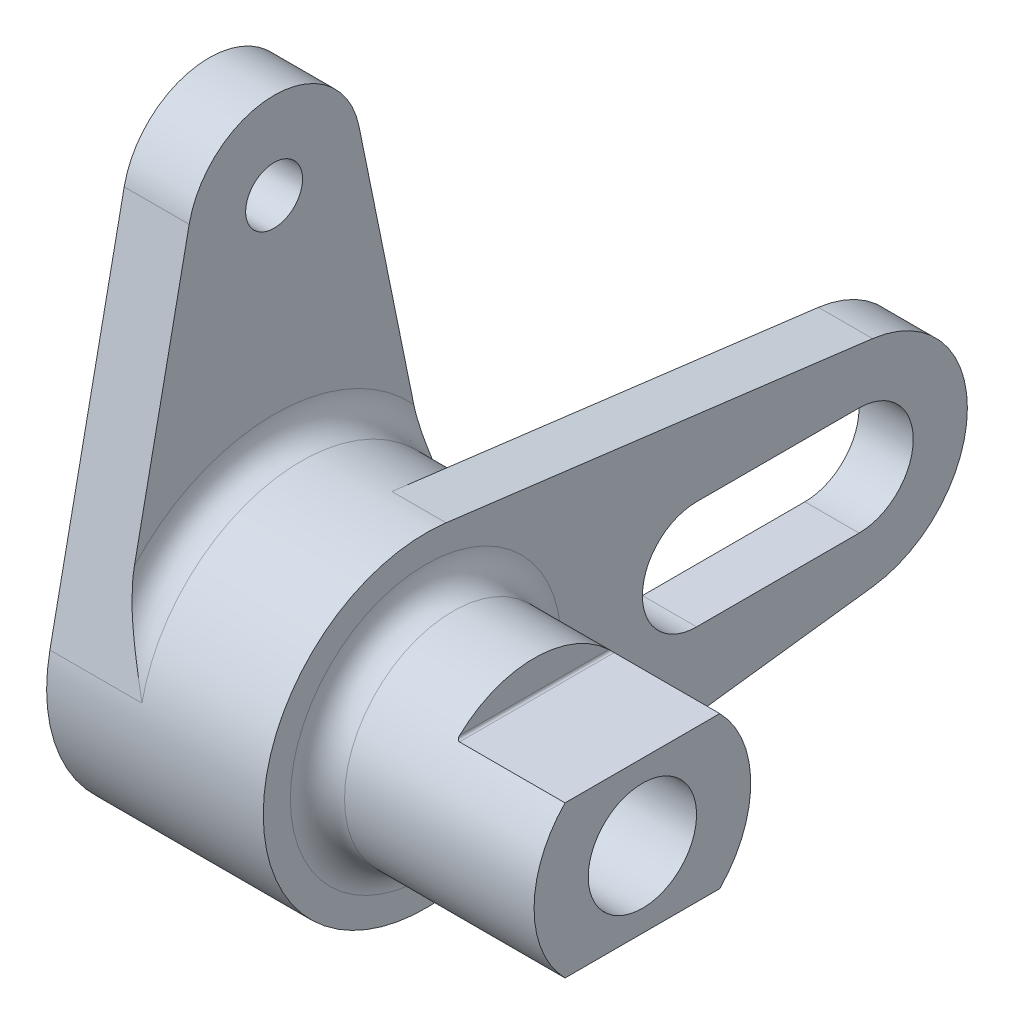
ISO-10303-21;
HEADER;
FILE_DESCRIPTION(('STEP AP214'),'2;1');
FILE_NAME('part.step','',(''),(''),'','','');
FILE_SCHEMA(('AUTOMOTIVE_DESIGN { 1 0 10303 214 1 1 1 1 }'));
ENDSEC;
DATA;
#1=APPLICATION_CONTEXT('core data for automotive mechanical design processes');
#2=APPLICATION_PROTOCOL_DEFINITION('international standard','automotive_design',2000,#1);
#3=PRODUCT_CONTEXT('',#1,'mechanical');
#4=PRODUCT('Part','Part','',(#3));
#5=PRODUCT_RELATED_PRODUCT_CATEGORY('part','',(#4));
#6=PRODUCT_DEFINITION_FORMATION('','',#4);
#7=PRODUCT_DEFINITION_CONTEXT('part definition',#1,'design');
#8=PRODUCT_DEFINITION('design','',#6,#7);
#9=PRODUCT_DEFINITION_SHAPE('','',#8);
#10=(LENGTH_UNIT() NAMED_UNIT(*) SI_UNIT(.MILLI.,.METRE.));
#11=(NAMED_UNIT(*) PLANE_ANGLE_UNIT() SI_UNIT($,.RADIAN.));
#12=(NAMED_UNIT(*) SI_UNIT($,.STERADIAN.) SOLID_ANGLE_UNIT());
#13=UNCERTAINTY_MEASURE_WITH_UNIT(LENGTH_MEASURE(1.E-05),#10,'distance_accuracy_value','');
#14=(GEOMETRIC_REPRESENTATION_CONTEXT(3) GLOBAL_UNCERTAINTY_ASSIGNED_CONTEXT((#13)) GLOBAL_UNIT_ASSIGNED_CONTEXT((#10,
#11,#12)) REPRESENTATION_CONTEXT('',''));
#15=CARTESIAN_POINT('',(0.,0.,0.));
#16=DIRECTION('',(0.,0.,1.));
#17=DIRECTION('',(1.,0.,0.));
#18=AXIS2_PLACEMENT_3D('',#15,#16,#17);
#19=CARTESIAN_POINT('',(80.,10.,0.));
#20=DIRECTION('',(-1.,0.,0.));
#21=DIRECTION('',(0.,0.,1.));
#22=AXIS2_PLACEMENT_3D('',#19,#20,#21);
#23=PLANE('',#22);
#24=CARTESIAN_POINT('',(80.,0.,0.));
#25=DIRECTION('',(-1.,0.,0.));
#26=DIRECTION('',(0.,0.,1.));
#27=AXIS2_PLACEMENT_3D('',#24,#25,#26);
#28=CIRCLE('',#27,10.);
#29=CARTESIAN_POINT('',(80.,0.,10.));
#30=VERTEX_POINT('',#29);
#31=EDGE_CURVE('E208',#30,#30,#28,.T.);
#32=ORIENTED_EDGE('',*,*,#31,.T.);
#33=EDGE_LOOP('',(#32));
#34=FACE_BOUND('',#33,.T.);
#35=DIRECTION('',(0.,0.,-1.));
#36=VECTOR('',#35,1.);
#37=CARTESIAN_POINT('',(80.,-14.,20.));
#38=LINE('',#37,#36);
#39=CARTESIAN_POINT('',(80.,-14.,14.2828568570857));
#40=VERTEX_POINT('',#39);
#41=CARTESIAN_POINT('',(80.,-14.,-14.2828568570857));
#42=VERTEX_POINT('',#41);
#43=EDGE_CURVE('E188',#40,#42,#38,.T.);
#44=ORIENTED_EDGE('',*,*,#43,.T.);
#45=CARTESIAN_POINT('',(80.,0.,0.));
#46=DIRECTION('',(-1.,0.,0.));
#47=DIRECTION('',(0.,0.,1.));
#48=AXIS2_PLACEMENT_3D('',#45,#46,#47);
#49=CIRCLE('',#48,20.);
#50=CARTESIAN_POINT('',(80.,14.,-14.2828568570857));
#51=VERTEX_POINT('',#50);
#52=EDGE_CURVE('E196',#51,#42,#49,.T.);
#53=ORIENTED_EDGE('',*,*,#52,.F.);
#54=DIRECTION('',(0.,0.,1.));
#55=VECTOR('',#54,1.);
#56=CARTESIAN_POINT('',(80.,14.,20.));
#57=LINE('',#56,#55);
#58=CARTESIAN_POINT('',(80.,14.,14.2828568570857));
#59=VERTEX_POINT('',#58);
#60=EDGE_CURVE('E177',#51,#59,#57,.T.);
#61=ORIENTED_EDGE('',*,*,#60,.T.);
#62=EDGE_CURVE('E205',#40,#59,#49,.T.);
#63=ORIENTED_EDGE('',*,*,#62,.F.);
#64=EDGE_LOOP('',(#44,#53,#61,#63));
#65=FACE_BOUND('',#64,.T.);
#66=ADVANCED_FACE('F42',(#34,#65),#23,.F.);
#67=CARTESIAN_POINT('',(0.,0.,0.));
#68=DIRECTION('',(-1.,0.,0.));
#69=DIRECTION('',(0.,0.,1.));
#70=AXIS2_PLACEMENT_3D('',#67,#68,#69);
#71=CYLINDRICAL_SURFACE('',#70,20.);
#72=CARTESIAN_POINT('',(45.,0.,0.));
#73=DIRECTION('',(-1.,0.,0.));
#74=DIRECTION('',(0.,0.,1.));
#75=AXIS2_PLACEMENT_3D('',#72,#73,#74);
#76=CIRCLE('',#75,20.);
#77=CARTESIAN_POINT('',(45.,0.,20.));
#78=VERTEX_POINT('',#77);
#79=EDGE_CURVE('E290',#78,#78,#76,.F.);
#80=ORIENTED_EDGE('',*,*,#79,.T.);
#81=EDGE_LOOP('',(#80));
#82=FACE_BOUND('',#81,.T.);
#83=DIRECTION('',(-1.,0.,0.));
#84=VECTOR('',#83,1.);
#85=CARTESIAN_POINT('',(0.,-14.,14.2828568570857));
#86=LINE('',#85,#84);
#87=CARTESIAN_POINT('',(60.5,-14.,14.2828568570857));
#88=VERTEX_POINT('',#87);
#89=EDGE_CURVE('E224',#40,#88,#86,.T.);
#90=ORIENTED_EDGE('',*,*,#89,.F.);
#91=ORIENTED_EDGE('',*,*,#62,.T.);
#92=DIRECTION('',(-1.,0.,0.));
#93=VECTOR('',#92,1.);
#94=CARTESIAN_POINT('',(0.,14.,14.2828568570857));
#95=LINE('',#94,#93);
#96=CARTESIAN_POINT('',(60.5,14.,14.2828568570857));
#97=VERTEX_POINT('',#96);
#98=EDGE_CURVE('E184',#97,#59,#95,.F.);
#99=ORIENTED_EDGE('',*,*,#98,.F.);
#100=CARTESIAN_POINT('',(60.5,14.,14.2828568570857));
#101=CARTESIAN_POINT('',(60.477494661395,13.9999622719365,14.282892211907));
#102=CARTESIAN_POINT('',(60.4550427668654,14.0015168375368,14.2813701041783));
#103=CARTESIAN_POINT('',(60.4110817284993,14.0074848994275,14.2755173597065));
#104=CARTESIAN_POINT('',(60.3895663255434,14.0118746555228,14.2712100442842));
#105=CARTESIAN_POINT('',(60.3479735871636,14.0231825032615,14.2600985504329));
#106=CARTESIAN_POINT('',(60.3278927330725,14.0300941354273,14.2533007508946));
#107=CARTESIAN_POINT('',(60.28943237724,14.0460227920367,14.2376040838453));
#108=CARTESIAN_POINT('',(60.27105662959,14.0550443150259,14.2287007265671));
#109=CARTESIAN_POINT('',(60.229408634353,14.0786264465018,14.2053738472395));
#110=CARTESIAN_POINT('',(60.2070291832468,14.0939739336551,14.1901527945545));
#111=CARTESIAN_POINT('',(60.1660399055829,14.1269512045527,14.157323007627));
#112=CARTESIAN_POINT('',(60.1474364463404,14.144584762517,14.1397103225539));
#113=CARTESIAN_POINT('',(60.107327308579,14.1885446525953,14.0956199389038));
#114=CARTESIAN_POINT('',(60.0874878196058,14.2155927794266,14.0683506116487));
#115=CARTESIAN_POINT('',(60.0541251796631,14.2714045210313,14.0117310277543));
#116=CARTESIAN_POINT('',(60.0406189648458,14.3001725062299,13.9823754305029));
#117=CARTESIAN_POINT('',(60.0198038427119,14.3574887665468,13.9235102048875));
#118=CARTESIAN_POINT('',(60.0122920816588,14.3860086315521,13.8940429847191));
#119=CARTESIAN_POINT('',(60.002424350045,14.4430630901981,13.8347258889886));
#120=CARTESIAN_POINT('',(60.0000271050636,14.4715956928404,13.8048810471959));
#121=CARTESIAN_POINT('',(60.,14.5,13.7749773139559));
#122=B_SPLINE_CURVE_WITH_KNOTS('',3,(#100,#101,#102,#103,#104,#105,#106,#107,#108,#109,#110,
#111,#112,#113,#114,#115,#116,#117,#118,#119,#120,#121),.UNSPECIFIED.,.F.,.F.,(4,2,2,2,2,2,2,2,
2,2,4),(0.,0.0673263470597112,0.134096126555386,0.200696070385865,0.267439329271865,
0.360265284093815,0.453246490738683,0.582236702285951,0.711569913643078,0.836314992419367,
0.960049503125349),.UNSPECIFIED.);
#123=CARTESIAN_POINT('',(60.,14.5,13.7749773139559));
#124=VERTEX_POINT('',#123);
#125=EDGE_CURVE('E238',#97,#124,#122,.T.);
#126=ORIENTED_EDGE('',*,*,#125,.T.);
#127=CARTESIAN_POINT('',(60.,0.,0.));
#128=DIRECTION('',(1.,0.,0.));
#129=DIRECTION('',(0.,0.,-1.));
#130=AXIS2_PLACEMENT_3D('',#127,#128,#129);
#131=CIRCLE('',#130,20.);
#132=CARTESIAN_POINT('',(60.,14.5,-13.7749773139559));
#133=VERTEX_POINT('',#132);
#134=EDGE_CURVE('E202',#133,#124,#131,.T.);
#135=ORIENTED_EDGE('',*,*,#134,.F.);
#136=CARTESIAN_POINT('',(60.,14.5,-13.7749773139559));
#137=CARTESIAN_POINT('',(60.0000080312996,14.4807499249937,-13.7952407357506));
#138=CARTESIAN_POINT('',(60.0011119909181,14.4614694931256,-13.8154505218481));
#139=CARTESIAN_POINT('',(60.0055937352017,14.4229169512674,-13.855693649308));
#140=CARTESIAN_POINT('',(60.0089756476998,14.40364492005,-13.8757266033549));
#141=CARTESIAN_POINT('',(60.022739395715,14.3456993827333,-13.9357093348323));
#142=CARTESIAN_POINT('',(60.0367424310823,14.3072534268503,-13.9751673019818));
#143=CARTESIAN_POINT('',(60.0687382527229,14.2454881069387,-14.0380664338392));
#144=CARTESIAN_POINT('',(60.08374044018,14.2214825901265,-14.0623796621282));
#145=CARTESIAN_POINT('',(60.1187085955669,14.1752658211089,-14.1089653491334));
#146=CARTESIAN_POINT('',(60.138656446586,14.1530484037623,-14.131244858967));
#147=CARTESIAN_POINT('',(60.1784079523328,14.1164352821655,-14.1678070688048));
#148=CARTESIAN_POINT('',(60.1970814918783,14.1014468749487,-14.1827211597233));
#149=CARTESIAN_POINT('',(60.2375620145095,14.0737064492904,-14.2102486595528));
#150=CARTESIAN_POINT('',(60.2593661997564,14.060952456325,-14.2228641001514));
#151=CARTESIAN_POINT('',(60.3012871689917,14.0407153549967,-14.2428393913386));
#152=CARTESIAN_POINT('',(60.3208794910931,14.0326885038286,-14.2507454096097));
#153=CARTESIAN_POINT('',(60.3616411764,14.0190462998866,-14.2641660321524));
#154=CARTESIAN_POINT('',(60.3828070957977,14.0134258530204,-14.269685688334));
#155=CARTESIAN_POINT('',(60.420022411921,14.0061847266258,-14.2767926428851));
#156=CARTESIAN_POINT('',(60.435814180398,14.0038810216126,-14.2790519466013));
#157=CARTESIAN_POINT('',(60.4677313695244,14.000781570244,-14.2820907677102));
#158=CARTESIAN_POINT('',(60.4838576379134,13.9999902980697,-14.2828658945224));
#159=CARTESIAN_POINT('',(60.5,14.,-14.2828568570857));
#160=B_SPLINE_CURVE_WITH_KNOTS('',3,(#136,#137,#138,#139,#140,#141,#142,#143,#144,#145,#146,
#147,#148,#149,#150,#151,#152,#153,#154,#155,#156,#157,#158,#159),.UNSPECIFIED.,.F.,.F.,(4,2,2,
2,2,2,2,2,2,2,2,4),(0.,0.0837874837691639,0.167727207089053,0.337143725549736,0.448766606793664,
0.55998648205081,0.644328774603908,0.72859615479462,0.796133110002654,0.863526381445501,
0.911745253995978,0.960106551431287),.UNSPECIFIED.);
#161=CARTESIAN_POINT('',(60.5,14.,-14.2828568570857));
#162=VERTEX_POINT('',#161);
#163=EDGE_CURVE('E200',#133,#162,#160,.T.);
#164=ORIENTED_EDGE('',*,*,#163,.T.);
#165=DIRECTION('',(-1.,0.,0.));
#166=VECTOR('',#165,1.);
#167=CARTESIAN_POINT('',(0.,14.,-14.2828568570857));
#168=LINE('',#167,#166);
#169=EDGE_CURVE('E181',#51,#162,#168,.T.);
#170=ORIENTED_EDGE('',*,*,#169,.F.);
#171=ORIENTED_EDGE('',*,*,#52,.T.);
#172=DIRECTION('',(-1.,0.,0.));
#173=VECTOR('',#172,1.);
#174=CARTESIAN_POINT('',(0.,-14.,-14.2828568570857));
#175=LINE('',#174,#173);
#176=CARTESIAN_POINT('',(60.5,-14.,-14.2828568570857));
#177=VERTEX_POINT('',#176);
#178=EDGE_CURVE('E201',#177,#42,#175,.F.);
#179=ORIENTED_EDGE('',*,*,#178,.F.);
#180=CARTESIAN_POINT('',(60.5,-14.,-14.2828568570857));
#181=CARTESIAN_POINT('',(60.477494661395,-13.9999622719365,-14.282892211907));
#182=CARTESIAN_POINT('',(60.4550427668654,-14.0015168375368,-14.2813701041783));
#183=CARTESIAN_POINT('',(60.4110817284993,-14.0074848994275,-14.2755173597065));
#184=CARTESIAN_POINT('',(60.3895663255434,-14.0118746555228,-14.2712100442842));
#185=CARTESIAN_POINT('',(60.3479735871636,-14.0231825032615,-14.2600985504329));
#186=CARTESIAN_POINT('',(60.3278927330725,-14.0300941354273,-14.2533007508946));
#187=CARTESIAN_POINT('',(60.28943237724,-14.0460227920367,-14.2376040838453));
#188=CARTESIAN_POINT('',(60.27105662959,-14.0550443150259,-14.2287007265671));
#189=CARTESIAN_POINT('',(60.229408634353,-14.0786264465018,-14.2053738472395));
#190=CARTESIAN_POINT('',(60.2070291832468,-14.0939739336551,-14.1901527945545));
#191=CARTESIAN_POINT('',(60.1660399055829,-14.1269512045527,-14.157323007627));
#192=CARTESIAN_POINT('',(60.1474364463404,-14.144584762517,-14.1397103225539));
#193=CARTESIAN_POINT('',(60.107327308579,-14.1885446525953,-14.0956199389038));
#194=CARTESIAN_POINT('',(60.0874878196058,-14.2155927794266,-14.0683506116487));
#195=CARTESIAN_POINT('',(60.0541251796631,-14.2714045210313,-14.0117310277543));
#196=CARTESIAN_POINT('',(60.0406189648458,-14.3001725062299,-13.9823754305029));
#197=CARTESIAN_POINT('',(60.0198038427119,-14.3574887665468,-13.9235102048875));
#198=CARTESIAN_POINT('',(60.0122920816588,-14.3860086315521,-13.8940429847191));
#199=CARTESIAN_POINT('',(60.002424350045,-14.4430630901981,-13.8347258889886));
#200=CARTESIAN_POINT('',(60.0000271050636,-14.4715956928404,-13.8048810471959));
#201=CARTESIAN_POINT('',(60.,-14.5,-13.7749773139559));
#202=B_SPLINE_CURVE_WITH_KNOTS('',3,(#180,#181,#182,#183,#184,#185,#186,#187,#188,#189,#190,
#191,#192,#193,#194,#195,#196,#197,#198,#199,#200,#201),.UNSPECIFIED.,.F.,.F.,(4,2,2,2,2,2,2,2,
2,2,4),(0.,0.0673263470597113,0.134096126555387,0.200696070385875,0.267439329271865,
0.360265284093811,0.453246490738684,0.582236702285949,0.711569913643077,0.836314992419363,
0.960049503125349),.UNSPECIFIED.);
#203=CARTESIAN_POINT('',(60.,-14.5,-13.7749773139559));
#204=VERTEX_POINT('',#203);
#205=EDGE_CURVE('E271',#177,#204,#202,.T.);
#206=ORIENTED_EDGE('',*,*,#205,.T.);
#207=CARTESIAN_POINT('',(60.,-14.5,13.7749773139559));
#208=VERTEX_POINT('',#207);
#209=EDGE_CURVE('E222',#208,#204,#131,.T.);
#210=ORIENTED_EDGE('',*,*,#209,.F.);
#211=CARTESIAN_POINT('',(60.,-14.5,13.7749773139559));
#212=CARTESIAN_POINT('',(60.0000080312996,-14.4807499249937,13.7952407357506));
#213=CARTESIAN_POINT('',(60.0011119909181,-14.4614694931256,13.8154505218481));
#214=CARTESIAN_POINT('',(60.0055937352017,-14.4229169512674,13.855693649308));
#215=CARTESIAN_POINT('',(60.0089756476998,-14.40364492005,13.8757266033549));
#216=CARTESIAN_POINT('',(60.022739395715,-14.3456993827333,13.9357093348323));
#217=CARTESIAN_POINT('',(60.0367424310823,-14.3072534268503,13.9751673019818));
#218=CARTESIAN_POINT('',(60.0687382527229,-14.2454881069387,14.0380664338392));
#219=CARTESIAN_POINT('',(60.08374044018,-14.2214825901265,14.0623796621282));
#220=CARTESIAN_POINT('',(60.1187085955669,-14.1752658211089,14.1089653491334));
#221=CARTESIAN_POINT('',(60.138656446586,-14.1530484037623,14.131244858967));
#222=CARTESIAN_POINT('',(60.1784079523328,-14.1164352821655,14.1678070688048));
#223=CARTESIAN_POINT('',(60.1970814918783,-14.1014468749487,14.1827211597233));
#224=CARTESIAN_POINT('',(60.2375620145095,-14.0737064492905,14.2102486595528));
#225=CARTESIAN_POINT('',(60.2593661997564,-14.060952456325,14.2228641001514));
#226=CARTESIAN_POINT('',(60.3012871689917,-14.0407153549967,14.2428393913386));
#227=CARTESIAN_POINT('',(60.3208794910931,-14.0326885038286,14.2507454096097));
#228=CARTESIAN_POINT('',(60.3616411764,-14.0190462998866,14.2641660321524));
#229=CARTESIAN_POINT('',(60.3828070957977,-14.0134258530204,14.269685688334));
#230=CARTESIAN_POINT('',(60.420022411921,-14.0061847266258,14.276792642885));
#231=CARTESIAN_POINT('',(60.435814180398,-14.0038810216126,14.2790519466012));
#232=CARTESIAN_POINT('',(60.4677313695244,-14.000781570244,14.2820907677102));
#233=CARTESIAN_POINT('',(60.4838576379134,-13.9999902980697,14.2828658945224));
#234=CARTESIAN_POINT('',(60.5,-14.,14.2828568570857));
#235=B_SPLINE_CURVE_WITH_KNOTS('',3,(#211,#212,#213,#214,#215,#216,#217,#218,#219,#220,#221,
#222,#223,#224,#225,#226,#227,#228,#229,#230,#231,#232,#233,#234),.UNSPECIFIED.,.F.,.F.,(4,2,2,
2,2,2,2,2,2,2,2,4),(0.,0.0837874837691627,0.167727207089052,0.337143725549736,0.448766606793663,
0.55998648205081,0.644328774603908,0.72859615479462,0.796133110002654,0.863526381445501,
0.911745253995978,0.960106551431287),.UNSPECIFIED.);
#236=EDGE_CURVE('E277',#208,#88,#235,.T.);
#237=ORIENTED_EDGE('',*,*,#236,.T.);
#238=EDGE_LOOP('',(#90,#91,#99,#126,#135,#164,#170,#171,#179,#206,#210,#237));
#239=FACE_BOUND('',#238,.T.);
#240=ADVANCED_FACE('F194',(#82,#239),#71,.T.);
#241=CARTESIAN_POINT('',(0.,30.,0.));
#242=DIRECTION('',(1.,0.,0.));
#243=DIRECTION('',(0.,0.,-1.));
#244=AXIS2_PLACEMENT_3D('',#241,#242,#243);
#245=PLANE('',#244);
#246=CARTESIAN_POINT('',(0.,70.,0.));
#247=DIRECTION('',(1.,0.,0.));
#248=DIRECTION('',(0.,0.,-1.));
#249=AXIS2_PLACEMENT_3D('',#246,#247,#248);
#250=CIRCLE('',#249,5.25);
#251=CARTESIAN_POINT('',(0.,70.,-5.25000000000001));
#252=VERTEX_POINT('',#251);
#253=EDGE_CURVE('E189',#252,#252,#250,.T.);
#254=ORIENTED_EDGE('',*,*,#253,.T.);
#255=EDGE_LOOP('',(#254));
#256=FACE_BOUND('',#255,.T.);
#257=CARTESIAN_POINT('',(0.,0.,0.));
#258=DIRECTION('',(-1.,0.,0.));
#259=DIRECTION('',(0.,0.,1.));
#260=AXIS2_PLACEMENT_3D('',#257,#258,#259);
#261=CIRCLE('',#260,10.);
#262=CARTESIAN_POINT('',(0.,0.,10.));
#263=VERTEX_POINT('',#262);
#264=EDGE_CURVE('E215',#263,#263,#261,.T.);
#265=ORIENTED_EDGE('',*,*,#264,.F.);
#266=EDGE_LOOP('',(#265));
#267=FACE_BOUND('',#266,.T.);
#268=CARTESIAN_POINT('',(0.,0.,0.));
#269=DIRECTION('',(-1.,0.,0.));
#270=DIRECTION('',(0.,0.,1.));
#271=AXIS2_PLACEMENT_3D('',#268,#269,#270);
#272=CIRCLE('',#271,30.);
#273=CARTESIAN_POINT('',(0.,6.,-29.3938769133981));
#274=VERTEX_POINT('',#273);
#275=CARTESIAN_POINT('',(0.,6.,29.3938769133981));
#276=VERTEX_POINT('',#275);
#277=EDGE_CURVE('E209',#274,#276,#272,.T.);
#278=ORIENTED_EDGE('',*,*,#277,.T.);
#279=DIRECTION('',(0.,-0.979795897113271,0.2));
#280=VECTOR('',#279,1.);
#281=CARTESIAN_POINT('',(0.,73.2,15.6767343538123));
#282=LINE('',#281,#280);
#283=CARTESIAN_POINT('',(0.,73.2,15.6767343538123));
#284=VERTEX_POINT('',#283);
#285=EDGE_CURVE('E338',#284,#276,#282,.T.);
#286=ORIENTED_EDGE('',*,*,#285,.F.);
#287=CARTESIAN_POINT('',(0.,70.,0.));
#288=DIRECTION('',(1.,0.,0.));
#289=DIRECTION('',(0.,0.,-1.));
#290=AXIS2_PLACEMENT_3D('',#287,#288,#289);
#291=CIRCLE('',#290,16.);
#292=CARTESIAN_POINT('',(0.,73.2,-15.6767343538123));
#293=VERTEX_POINT('',#292);
#294=EDGE_CURVE('E347',#293,#284,#291,.T.);
#295=ORIENTED_EDGE('',*,*,#294,.F.);
#296=DIRECTION('',(0.,0.979795897113271,0.2));
#297=VECTOR('',#296,1.);
#298=CARTESIAN_POINT('',(0.,73.2,-15.6767343538123));
#299=LINE('',#298,#297);
#300=EDGE_CURVE('E340',#274,#293,#299,.T.);
#301=ORIENTED_EDGE('',*,*,#300,.F.);
#302=EDGE_LOOP('',(#278,#286,#295,#301));
#303=FACE_BOUND('',#302,.T.);
#304=ADVANCED_FACE('F262',(#256,#267,#303),#245,.F.);
#305=CARTESIAN_POINT('',(0.,0.,0.));
#306=DIRECTION('',(-1.,0.,0.));
#307=DIRECTION('',(0.,0.,1.));
#308=AXIS2_PLACEMENT_3D('',#305,#306,#307);
#309=CYLINDRICAL_SURFACE('',#308,10.);
#310=ORIENTED_EDGE('',*,*,#31,.F.);
#311=EDGE_LOOP('',(#310));
#312=FACE_BOUND('',#311,.T.);
#313=ORIENTED_EDGE('',*,*,#264,.T.);
#314=EDGE_LOOP('',(#313));
#315=FACE_BOUND('',#314,.T.);
#316=ADVANCED_FACE('F314',(#312,#315),#309,.F.);
#317=CARTESIAN_POINT('',(40.,20.,0.));
#318=DIRECTION('',(-1.,0.,0.));
#319=DIRECTION('',(0.,0.,1.));
#320=AXIS2_PLACEMENT_3D('',#317,#318,#319);
#321=PLANE('',#320);
#322=CARTESIAN_POINT('',(40.,0.,0.));
#323=DIRECTION('',(-1.,0.,0.));
#324=DIRECTION('',(0.,0.,1.));
#325=AXIS2_PLACEMENT_3D('',#322,#323,#324);
#326=CIRCLE('',#325,25.);
#327=CARTESIAN_POINT('',(40.,0.,25.));
#328=VERTEX_POINT('',#327);
#329=EDGE_CURVE('E287',#328,#328,#326,.T.);
#330=ORIENTED_EDGE('',*,*,#329,.T.);
#331=EDGE_LOOP('',(#330));
#332=FACE_BOUND('',#331,.T.);
#333=CARTESIAN_POINT('',(40.,0.,0.));
#334=DIRECTION('',(-1.,0.,0.));
#335=DIRECTION('',(0.,0.,1.));
#336=AXIS2_PLACEMENT_3D('',#333,#334,#335);
#337=CIRCLE('',#336,30.);
#338=CARTESIAN_POINT('',(40.,-29.7647022494766,-3.75));
#339=VERTEX_POINT('',#338);
#340=CARTESIAN_POINT('',(40.,29.7647022494766,-3.75));
#341=VERTEX_POINT('',#340);
#342=EDGE_CURVE('E206',#339,#341,#337,.T.);
#343=ORIENTED_EDGE('',*,*,#342,.F.);
#344=DIRECTION('',(0.,0.125,-0.992156741649221));
#345=VECTOR('',#344,1.);
#346=CARTESIAN_POINT('',(40.,-29.7647022494766,-3.75));
#347=LINE('',#346,#345);
#348=CARTESIAN_POINT('',(40.,-19.8431348329844,-82.5));
#349=VERTEX_POINT('',#348);
#350=EDGE_CURVE('E390',#339,#349,#347,.T.);
#351=ORIENTED_EDGE('',*,*,#350,.T.);
#352=CARTESIAN_POINT('',(40.,0.,-80.));
#353=DIRECTION('',(1.,0.,0.));
#354=DIRECTION('',(0.,0.,-1.));
#355=AXIS2_PLACEMENT_3D('',#352,#353,#354);
#356=CIRCLE('',#355,20.);
#357=CARTESIAN_POINT('',(40.,19.8431348329844,-82.5));
#358=VERTEX_POINT('',#357);
#359=EDGE_CURVE('E387',#349,#358,#356,.T.);
#360=ORIENTED_EDGE('',*,*,#359,.T.);
#361=DIRECTION('',(0.,0.125,0.992156741649221));
#362=VECTOR('',#361,1.);
#363=CARTESIAN_POINT('',(40.,29.7647022494766,-3.75));
#364=LINE('',#363,#362);
#365=EDGE_CURVE('E383',#358,#341,#364,.T.);
#366=ORIENTED_EDGE('',*,*,#365,.T.);
#367=EDGE_LOOP('',(#343,#351,#360,#366));
#368=FACE_BOUND('',#367,.T.);
#369=CARTESIAN_POINT('',(40.,0.,-80.));
#370=DIRECTION('',(1.,0.,0.));
#371=DIRECTION('',(0.,0.,-1.));
#372=AXIS2_PLACEMENT_3D('',#369,#370,#371);
#373=CIRCLE('',#372,10.);
#374=CARTESIAN_POINT('',(40.,-10.,-80.));
#375=VERTEX_POINT('',#374);
#376=CARTESIAN_POINT('',(40.,10.,-80.));
#377=VERTEX_POINT('',#376);
#378=EDGE_CURVE('E420',#375,#377,#373,.T.);
#379=ORIENTED_EDGE('',*,*,#378,.F.);
#380=DIRECTION('',(0.,0.,-1.));
#381=VECTOR('',#380,1.);
#382=CARTESIAN_POINT('',(40.,-10.,-80.));
#383=LINE('',#382,#381);
#384=CARTESIAN_POINT('',(40.,-10.,-50.));
#385=VERTEX_POINT('',#384);
#386=EDGE_CURVE('E410',#385,#375,#383,.T.);
#387=ORIENTED_EDGE('',*,*,#386,.F.);
#388=CARTESIAN_POINT('',(40.,0.,-50.));
#389=DIRECTION('',(1.,0.,0.));
#390=DIRECTION('',(0.,0.,-1.));
#391=AXIS2_PLACEMENT_3D('',#388,#389,#390);
#392=CIRCLE('',#391,10.);
#393=CARTESIAN_POINT('',(40.,10.,-50.));
#394=VERTEX_POINT('',#393);
#395=EDGE_CURVE('E414',#394,#385,#392,.T.);
#396=ORIENTED_EDGE('',*,*,#395,.F.);
#397=DIRECTION('',(0.,0.,1.));
#398=VECTOR('',#397,1.);
#399=CARTESIAN_POINT('',(40.,10.,-80.));
#400=LINE('',#399,#398);
#401=EDGE_CURVE('E417',#377,#394,#400,.T.);
#402=ORIENTED_EDGE('',*,*,#401,.F.);
#403=EDGE_LOOP('',(#379,#387,#396,#402));
#404=FACE_BOUND('',#403,.T.);
#405=ADVANCED_FACE('F311',(#332,#368,#404),#321,.F.);
#406=CARTESIAN_POINT('',(0.,0.,0.));
#407=DIRECTION('',(-1.,0.,0.));
#408=DIRECTION('',(0.,0.,1.));
#409=AXIS2_PLACEMENT_3D('',#406,#407,#408);
#410=CYLINDRICAL_SURFACE('',#409,30.);
#411=ORIENTED_EDGE('',*,*,#342,.T.);
#412=DIRECTION('',(1.,0.,0.));
#413=VECTOR('',#412,1.);
#414=CARTESIAN_POINT('',(30.,29.7647022494766,-3.75));
#415=LINE('',#414,#413);
#416=CARTESIAN_POINT('',(30.,29.7647022494766,-3.75));
#417=VERTEX_POINT('',#416);
#418=EDGE_CURVE('E351',#417,#341,#415,.T.);
#419=ORIENTED_EDGE('',*,*,#418,.F.);
#420=CARTESIAN_POINT('',(30.,0.,0.));
#421=DIRECTION('',(1.,0.,0.));
#422=DIRECTION('',(0.,0.,-1.));
#423=AXIS2_PLACEMENT_3D('',#420,#421,#422);
#424=CIRCLE('',#423,30.);
#425=CARTESIAN_POINT('',(30.,-29.7647022494766,-3.75));
#426=VERTEX_POINT('',#425);
#427=EDGE_CURVE('E218',#426,#417,#424,.T.);
#428=ORIENTED_EDGE('',*,*,#427,.F.);
#429=DIRECTION('',(1.,0.,0.));
#430=VECTOR('',#429,1.);
#431=CARTESIAN_POINT('',(30.,-29.7647022494766,-3.75));
#432=LINE('',#431,#430);
#433=EDGE_CURVE('E373',#426,#339,#432,.T.);
#434=ORIENTED_EDGE('',*,*,#433,.T.);
#435=EDGE_LOOP('',(#411,#419,#428,#434));
#436=FACE_BOUND('',#435,.T.);
#437=CARTESIAN_POINT('',(17.,0.,0.));
#438=DIRECTION('',(1.,0.,0.));
#439=DIRECTION('',(0.,0.,-1.));
#440=AXIS2_PLACEMENT_3D('',#437,#438,#439);
#441=CIRCLE('',#440,30.);
#442=CARTESIAN_POINT('',(17.,6.,-29.3938769133981));
#443=VERTEX_POINT('',#442);
#444=CARTESIAN_POINT('',(17.,6.00000000000001,29.3938769133981));
#445=VERTEX_POINT('',#444);
#446=EDGE_CURVE('E283',#443,#445,#441,.T.);
#447=ORIENTED_EDGE('',*,*,#446,.T.);
#448=DIRECTION('',(-1.,0.,0.));
#449=VECTOR('',#448,1.);
#450=CARTESIAN_POINT('',(12.,6.00000000000001,29.3938769133981));
#451=LINE('',#450,#449);
#452=EDGE_CURVE('E344',#445,#276,#451,.T.);
#453=ORIENTED_EDGE('',*,*,#452,.T.);
#454=ORIENTED_EDGE('',*,*,#277,.F.);
#455=DIRECTION('',(-1.,0.,0.));
#456=VECTOR('',#455,1.);
#457=CARTESIAN_POINT('',(12.,6.,-29.3938769133981));
#458=LINE('',#457,#456);
#459=EDGE_CURVE('E358',#443,#274,#458,.T.);
#460=ORIENTED_EDGE('',*,*,#459,.F.);
#461=EDGE_LOOP('',(#447,#453,#454,#460));
#462=FACE_BOUND('',#461,.T.);
#463=ADVANCED_FACE('F309',(#436,#462),#410,.T.);
#464=CARTESIAN_POINT('',(12.,70.,0.));
#465=DIRECTION('',(1.,0.,0.));
#466=DIRECTION('',(0.,0.,-1.));
#467=AXIS2_PLACEMENT_3D('',#464,#465,#466);
#468=PLANE('',#467);
#469=CARTESIAN_POINT('',(12.,70.,0.));
#470=DIRECTION('',(1.,0.,0.));
#471=DIRECTION('',(0.,0.,-1.));
#472=AXIS2_PLACEMENT_3D('',#469,#470,#471);
#473=CIRCLE('',#472,5.25);
#474=CARTESIAN_POINT('',(12.,70.,-5.25000000000001));
#475=VERTEX_POINT('',#474);
#476=EDGE_CURVE('E435',#475,#475,#473,.T.);
#477=ORIENTED_EDGE('',*,*,#476,.F.);
#478=EDGE_LOOP('',(#477));
#479=FACE_BOUND('',#478,.T.);
#480=DIRECTION('',(0.,-0.979795897113271,0.2));
#481=VECTOR('',#480,1.);
#482=CARTESIAN_POINT('',(12.,73.2,15.6767343538123));
#483=LINE('',#482,#481);
#484=CARTESIAN_POINT('',(12.,73.2,15.6767343538123));
#485=VERTEX_POINT('',#484);
#486=CARTESIAN_POINT('',(12.,23.6635217326557,25.7883256379342));
#487=VERTEX_POINT('',#486);
#488=EDGE_CURVE('E369',#485,#487,#483,.T.);
#489=ORIENTED_EDGE('',*,*,#488,.T.);
#490=CARTESIAN_POINT('',(12.,0.,0.));
#491=DIRECTION('',(1.,0.,0.));
#492=DIRECTION('',(0.,0.,-1.));
#493=AXIS2_PLACEMENT_3D('',#490,#491,#492);
#494=CIRCLE('',#493,35.);
#495=CARTESIAN_POINT('',(12.,23.6635217326557,-25.7883256379341));
#496=VERTEX_POINT('',#495);
#497=EDGE_CURVE('E68',#487,#496,#494,.F.);
#498=ORIENTED_EDGE('',*,*,#497,.T.);
#499=DIRECTION('',(0.,0.979795897113271,0.2));
#500=VECTOR('',#499,1.);
#501=CARTESIAN_POINT('',(12.,73.2,-15.6767343538123));
#502=LINE('',#501,#500);
#503=CARTESIAN_POINT('',(12.,73.2,-15.6767343538123));
#504=VERTEX_POINT('',#503);
#505=EDGE_CURVE('E359',#496,#504,#502,.T.);
#506=ORIENTED_EDGE('',*,*,#505,.T.);
#507=CARTESIAN_POINT('',(12.,70.,0.));
#508=DIRECTION('',(1.,0.,0.));
#509=DIRECTION('',(0.,0.,-1.));
#510=AXIS2_PLACEMENT_3D('',#507,#508,#509);
#511=CIRCLE('',#510,16.);
#512=EDGE_CURVE('E349',#504,#485,#511,.T.);
#513=ORIENTED_EDGE('',*,*,#512,.T.);
#514=EDGE_LOOP('',(#489,#498,#506,#513));
#515=FACE_BOUND('',#514,.T.);
#516=ADVANCED_FACE('F307',(#479,#515),#468,.T.);
#517=CARTESIAN_POINT('',(12.,70.,0.));
#518=DIRECTION('',(-1.,0.,0.));
#519=DIRECTION('',(0.,0.,1.));
#520=AXIS2_PLACEMENT_3D('',#517,#518,#519);
#521=CYLINDRICAL_SURFACE('',#520,16.);
#522=ORIENTED_EDGE('',*,*,#294,.T.);
#523=DIRECTION('',(-1.,0.,0.));
#524=VECTOR('',#523,1.);
#525=CARTESIAN_POINT('',(12.,73.2,15.6767343538123));
#526=LINE('',#525,#524);
#527=EDGE_CURVE('E343',#485,#284,#526,.T.);
#528=ORIENTED_EDGE('',*,*,#527,.F.);
#529=ORIENTED_EDGE('',*,*,#512,.F.);
#530=DIRECTION('',(-1.,0.,0.));
#531=VECTOR('',#530,1.);
#532=CARTESIAN_POINT('',(12.,73.2,-15.6767343538123));
#533=LINE('',#532,#531);
#534=EDGE_CURVE('E355',#504,#293,#533,.T.);
#535=ORIENTED_EDGE('',*,*,#534,.T.);
#536=EDGE_LOOP('',(#522,#528,#529,#535));
#537=FACE_BOUND('',#536,.T.);
#538=ADVANCED_FACE('F302',(#537),#521,.T.);
#539=CARTESIAN_POINT('',(12.,73.2,15.6767343538123));
#540=DIRECTION('',(0.,-0.2,-0.979795897113271));
#541=DIRECTION('',(0.,0.979795897113271,-0.2));
#542=AXIS2_PLACEMENT_3D('',#539,#540,#541);
#543=PLANE('',#542);
#544=ORIENTED_EDGE('',*,*,#285,.T.);
#545=ORIENTED_EDGE('',*,*,#452,.F.);
#546=CARTESIAN_POINT('',(12.,23.6635217326557,25.7883256379342));
#547=CARTESIAN_POINT('',(12.0000035430437,23.4916430915169,25.8234102186402));
#548=CARTESIAN_POINT('',(12.0024489062427,23.3197779832095,25.8584920369687));
#549=CARTESIAN_POINT('',(12.0119359986986,22.9761857204614,25.9286275139104));
#550=CARTESIAN_POINT('',(12.018977264522,22.8044585538591,25.9636811750062));
#551=CARTESIAN_POINT('',(12.0465533580245,22.2898131993473,26.0687327180935));
#552=CARTESIAN_POINT('',(12.0735412082796,21.9472156949788,26.1386651408314));
#553=CARTESIAN_POINT('',(12.1426211194019,21.2644747446525,26.2780290537315));
#554=CARTESIAN_POINT('',(12.1846715902285,20.9243271465884,26.3474613914391));
#555=CARTESIAN_POINT('',(12.282171550255,20.2458475327,26.4859554626813));
#556=CARTESIAN_POINT('',(12.3376232361993,19.9075158238428,26.5550171335567));
#557=CARTESIAN_POINT('',(12.5205535244527,18.902221488181,26.7602219805301));
#558=CARTESIAN_POINT('',(12.665348713476,18.2382619856097,26.8957521464611));
#559=CARTESIAN_POINT('',(12.9915020799306,16.9187008467951,27.1651064360029));
#560=CARTESIAN_POINT('',(13.1728895361372,16.2631063531741,27.2989291016321));
#561=CARTESIAN_POINT('',(13.6134272925831,14.7955922421623,27.5984841651582));
#562=CARTESIAN_POINT('',(13.8806465962729,13.9860180873917,27.7637377975026));
#563=CARTESIAN_POINT('',(14.4463379463263,12.3773585145234,28.0921040577835));
#564=CARTESIAN_POINT('',(14.744818925945,11.5782761683505,28.2552160586659));
#565=CARTESIAN_POINT('',(15.6712748672839,9.18896833081909,28.7429314786981));
#566=CARTESIAN_POINT('',(16.3291464772451,7.61004862398272,29.0652271142464));
#567=CARTESIAN_POINT('',(16.9912713006433,6.02094890892551,29.3896007352702));
#568=CARTESIAN_POINT('',(16.9956356585988,6.01047445013649,29.3917388252173));
#569=CARTESIAN_POINT('',(17.,6.00000000000001,29.3938769133981));
#570=B_SPLINE_CURVE_WITH_KNOTS('',3,(#546,#547,#548,#549,#550,#551,#552,#553,#554,#555,#556,
#557,#558,#559,#560,#561,#562,#563,#564,#565,#566,#567,#568,#569),.UNSPECIFIED.,.F.,.F.,(4,2,2,
2,2,2,2,2,2,2,2,4),(0.,0.526228685360414,1.05240431597845,2.10409662995444,3.15290717670278,
4.20188976257783,6.27927543793286,8.35832994362685,10.9625753529994,13.56756698572,
18.7883727544022,18.8230137705546),.UNSPECIFIED.);
#571=EDGE_CURVE('E55',#445,#487,#570,.F.);
#572=ORIENTED_EDGE('',*,*,#571,.T.);
#573=ORIENTED_EDGE('',*,*,#488,.F.);
#574=ORIENTED_EDGE('',*,*,#527,.T.);
#575=EDGE_LOOP('',(#544,#545,#572,#573,#574));
#576=FACE_BOUND('',#575,.T.);
#577=ADVANCED_FACE('F297',(#576),#543,.F.);
#578=CARTESIAN_POINT('',(12.,73.2,-15.6767343538123));
#579=DIRECTION('',(0.,-0.2,0.979795897113271));
#580=DIRECTION('',(0.,-0.979795897113271,-0.2));
#581=AXIS2_PLACEMENT_3D('',#578,#579,#580);
#582=PLANE('',#581);
#583=ORIENTED_EDGE('',*,*,#300,.T.);
#584=ORIENTED_EDGE('',*,*,#534,.F.);
#585=ORIENTED_EDGE('',*,*,#505,.F.);
#586=CARTESIAN_POINT('',(12.,23.6635217326557,-25.7883256379341));
#587=CARTESIAN_POINT('',(12.0000035430437,23.4916430915146,-25.8234102186407));
#588=CARTESIAN_POINT('',(12.0024489062427,23.3197779832049,-25.8584920369696));
#589=CARTESIAN_POINT('',(12.011935998699,22.9761857204523,-25.9286275139123));
#590=CARTESIAN_POINT('',(12.0189772645225,22.8044585538477,-25.9636811750086));
#591=CARTESIAN_POINT('',(12.0465533580257,22.2898131993291,-26.0687327180972));
#592=CARTESIAN_POINT('',(12.0735412082815,21.9472156949561,-26.138665140836));
#593=CARTESIAN_POINT('',(12.1426211194054,21.2644747446219,-26.2780290537378));
#594=CARTESIAN_POINT('',(12.1846715902329,20.9243271465543,-26.347461391446));
#595=CARTESIAN_POINT('',(12.2821715502614,20.245847532659,-26.4859554626897));
#596=CARTESIAN_POINT('',(12.3376232362067,19.9075158237983,-26.5550171335657));
#597=CARTESIAN_POINT('',(12.520553524461,18.9022214881417,-26.7602219805381));
#598=CARTESIAN_POINT('',(12.6653487134835,18.2382619855792,-26.8957521464673));
#599=CARTESIAN_POINT('',(12.9915020799344,16.9187008467803,-27.1651064360059));
#600=CARTESIAN_POINT('',(13.172889536138,16.2631063531663,-27.2989291016337));
#601=CARTESIAN_POINT('',(13.6134272925846,14.7955922421639,-27.5984841651578));
#602=CARTESIAN_POINT('',(13.8806465962796,13.9860180873964,-27.7637377975016));
#603=CARTESIAN_POINT('',(14.4463379463174,12.3773585145251,-28.0921040577831));
#604=CARTESIAN_POINT('',(14.7448189259153,11.5782761683463,-28.2552160586668));
#605=CARTESIAN_POINT('',(15.6712748673362,9.18896833084666,-28.7429314786924));
#606=CARTESIAN_POINT('',(16.3291464775432,7.61004862410513,-29.065227114221));
#607=CARTESIAN_POINT('',(16.9912713006473,6.02094890892704,-29.3896007352699));
#608=CARTESIAN_POINT('',(16.9956356586008,6.01047445013725,-29.3917388252171));
#609=CARTESIAN_POINT('',(17.,6.,-29.3938769133981));
#610=B_SPLINE_CURVE_WITH_KNOTS('',3,(#586,#587,#588,#589,#590,#591,#592,#593,#594,#595,#596,
#597,#598,#599,#600,#601,#602,#603,#604,#605,#606,#607,#608,#609),.UNSPECIFIED.,.F.,.F.,(4,2,2,
2,2,2,2,2,2,2,2,4),(0.,0.526228685367418,1.05240431599245,2.10409662998226,3.15290717674147,
4.20188976262752,6.27927543795623,8.3583299436268,10.9625753529966,13.5675669857105,
18.7883727544023,18.8230137705546),.UNSPECIFIED.);
#611=EDGE_CURVE('E12',#496,#443,#610,.T.);
#612=ORIENTED_EDGE('',*,*,#611,.T.);
#613=ORIENTED_EDGE('',*,*,#459,.T.);
#614=EDGE_LOOP('',(#583,#584,#585,#612,#613));
#615=FACE_BOUND('',#614,.T.);
#616=ADVANCED_FACE('F301',(#615),#582,.F.);
#617=CARTESIAN_POINT('',(30.,29.7647022494766,-3.75));
#618=DIRECTION('',(0.,0.992156741649222,-0.125));
#619=DIRECTION('',(0.,0.125,0.992156741649222));
#620=AXIS2_PLACEMENT_3D('',#617,#618,#619);
#621=PLANE('',#620);
#622=ORIENTED_EDGE('',*,*,#365,.F.);
#623=DIRECTION('',(1.,0.,0.));
#624=VECTOR('',#623,1.);
#625=CARTESIAN_POINT('',(30.,19.8431348329844,-82.5));
#626=LINE('',#625,#624);
#627=CARTESIAN_POINT('',(30.,19.8431348329844,-82.5));
#628=VERTEX_POINT('',#627);
#629=EDGE_CURVE('E379',#628,#358,#626,.T.);
#630=ORIENTED_EDGE('',*,*,#629,.F.);
#631=DIRECTION('',(0.,0.125,0.992156741649221));
#632=VECTOR('',#631,1.);
#633=CARTESIAN_POINT('',(30.,29.7647022494766,-3.75));
#634=LINE('',#633,#632);
#635=EDGE_CURVE('E377',#628,#417,#634,.T.);
#636=ORIENTED_EDGE('',*,*,#635,.T.);
#637=ORIENTED_EDGE('',*,*,#418,.T.);
#638=EDGE_LOOP('',(#622,#630,#636,#637));
#639=FACE_BOUND('',#638,.T.);
#640=ADVANCED_FACE('F453',(#639),#621,.T.);
#641=CARTESIAN_POINT('',(30.,0.,-80.));
#642=DIRECTION('',(1.,0.,0.));
#643=DIRECTION('',(0.,0.,-1.));
#644=AXIS2_PLACEMENT_3D('',#641,#642,#643);
#645=CYLINDRICAL_SURFACE('',#644,20.);
#646=ORIENTED_EDGE('',*,*,#359,.F.);
#647=DIRECTION('',(1.,0.,0.));
#648=VECTOR('',#647,1.);
#649=CARTESIAN_POINT('',(30.,-19.8431348329844,-82.5));
#650=LINE('',#649,#648);
#651=CARTESIAN_POINT('',(30.,-19.8431348329844,-82.5));
#652=VERTEX_POINT('',#651);
#653=EDGE_CURVE('E376',#652,#349,#650,.T.);
#654=ORIENTED_EDGE('',*,*,#653,.F.);
#655=CARTESIAN_POINT('',(30.,0.,-80.));
#656=DIRECTION('',(1.,0.,0.));
#657=DIRECTION('',(0.,0.,-1.));
#658=AXIS2_PLACEMENT_3D('',#655,#656,#657);
#659=CIRCLE('',#658,20.);
#660=EDGE_CURVE('E396',#652,#628,#659,.T.);
#661=ORIENTED_EDGE('',*,*,#660,.T.);
#662=ORIENTED_EDGE('',*,*,#629,.T.);
#663=EDGE_LOOP('',(#646,#654,#661,#662));
#664=FACE_BOUND('',#663,.T.);
#665=ADVANCED_FACE('F449',(#664),#645,.T.);
#666=CARTESIAN_POINT('',(30.,-29.7647022494766,-3.75));
#667=DIRECTION('',(0.,-0.992156741649222,-0.125));
#668=DIRECTION('',(0.,0.125,-0.992156741649222));
#669=AXIS2_PLACEMENT_3D('',#666,#667,#668);
#670=PLANE('',#669);
#671=ORIENTED_EDGE('',*,*,#350,.F.);
#672=ORIENTED_EDGE('',*,*,#433,.F.);
#673=DIRECTION('',(0.,0.125,-0.992156741649221));
#674=VECTOR('',#673,1.);
#675=CARTESIAN_POINT('',(30.,-29.7647022494766,-3.75));
#676=LINE('',#675,#674);
#677=EDGE_CURVE('E386',#426,#652,#676,.T.);
#678=ORIENTED_EDGE('',*,*,#677,.T.);
#679=ORIENTED_EDGE('',*,*,#653,.T.);
#680=EDGE_LOOP('',(#671,#672,#678,#679));
#681=FACE_BOUND('',#680,.T.);
#682=ADVANCED_FACE('F445',(#681),#670,.T.);
#683=CARTESIAN_POINT('',(30.,0.,0.));
#684=DIRECTION('',(1.,0.,0.));
#685=DIRECTION('',(0.,0.,-1.));
#686=AXIS2_PLACEMENT_3D('',#683,#684,#685);
#687=PLANE('',#686);
#688=DIRECTION('',(0.,0.,-1.));
#689=VECTOR('',#688,1.);
#690=CARTESIAN_POINT('',(30.,-10.,-80.));
#691=LINE('',#690,#689);
#692=CARTESIAN_POINT('',(30.,-10.,-50.));
#693=VERTEX_POINT('',#692);
#694=CARTESIAN_POINT('',(30.,-10.,-80.));
#695=VERTEX_POINT('',#694);
#696=EDGE_CURVE('E405',#693,#695,#691,.T.);
#697=ORIENTED_EDGE('',*,*,#696,.T.);
#698=CARTESIAN_POINT('',(30.,0.,-80.));
#699=DIRECTION('',(1.,0.,0.));
#700=DIRECTION('',(0.,0.,-1.));
#701=AXIS2_PLACEMENT_3D('',#698,#699,#700);
#702=CIRCLE('',#701,10.);
#703=CARTESIAN_POINT('',(30.,10.,-80.));
#704=VERTEX_POINT('',#703);
#705=EDGE_CURVE('E413',#695,#704,#702,.T.);
#706=ORIENTED_EDGE('',*,*,#705,.T.);
#707=DIRECTION('',(0.,0.,1.));
#708=VECTOR('',#707,1.);
#709=CARTESIAN_POINT('',(30.,10.,-80.));
#710=LINE('',#709,#708);
#711=CARTESIAN_POINT('',(30.,10.,-50.));
#712=VERTEX_POINT('',#711);
#713=EDGE_CURVE('E427',#704,#712,#710,.T.);
#714=ORIENTED_EDGE('',*,*,#713,.T.);
#715=CARTESIAN_POINT('',(30.,0.,-50.));
#716=DIRECTION('',(1.,0.,0.));
#717=DIRECTION('',(0.,0.,-1.));
#718=AXIS2_PLACEMENT_3D('',#715,#716,#717);
#719=CIRCLE('',#718,10.);
#720=EDGE_CURVE('E424',#712,#693,#719,.T.);
#721=ORIENTED_EDGE('',*,*,#720,.T.);
#722=EDGE_LOOP('',(#697,#706,#714,#721));
#723=FACE_BOUND('',#722,.T.);
#724=ORIENTED_EDGE('',*,*,#677,.F.);
#725=ORIENTED_EDGE('',*,*,#427,.T.);
#726=ORIENTED_EDGE('',*,*,#635,.F.);
#727=ORIENTED_EDGE('',*,*,#660,.F.);
#728=EDGE_LOOP('',(#724,#725,#726,#727));
#729=FACE_BOUND('',#728,.T.);
#730=ADVANCED_FACE('F448',(#723,#729),#687,.F.);
#731=CARTESIAN_POINT('',(30.,0.,-80.));
#732=DIRECTION('',(1.,0.,0.));
#733=DIRECTION('',(0.,0.,-1.));
#734=AXIS2_PLACEMENT_3D('',#731,#732,#733);
#735=CYLINDRICAL_SURFACE('',#734,10.);
#736=ORIENTED_EDGE('',*,*,#378,.T.);
#737=DIRECTION('',(1.,0.,0.));
#738=VECTOR('',#737,1.);
#739=CARTESIAN_POINT('',(30.,10.,-80.));
#740=LINE('',#739,#738);
#741=EDGE_CURVE('E401',#704,#377,#740,.T.);
#742=ORIENTED_EDGE('',*,*,#741,.F.);
#743=ORIENTED_EDGE('',*,*,#705,.F.);
#744=DIRECTION('',(1.,0.,0.));
#745=VECTOR('',#744,1.);
#746=CARTESIAN_POINT('',(30.,-10.,-80.));
#747=LINE('',#746,#745);
#748=EDGE_CURVE('E393',#695,#375,#747,.T.);
#749=ORIENTED_EDGE('',*,*,#748,.T.);
#750=EDGE_LOOP('',(#736,#742,#743,#749));
#751=FACE_BOUND('',#750,.T.);
#752=ADVANCED_FACE('F460',(#751),#735,.F.);
#753=CARTESIAN_POINT('',(30.,-10.,-80.));
#754=DIRECTION('',(0.,-1.,0.));
#755=DIRECTION('',(0.,0.,-1.));
#756=AXIS2_PLACEMENT_3D('',#753,#754,#755);
#757=PLANE('',#756);
#758=ORIENTED_EDGE('',*,*,#386,.T.);
#759=ORIENTED_EDGE('',*,*,#748,.F.);
#760=ORIENTED_EDGE('',*,*,#696,.F.);
#761=DIRECTION('',(1.,0.,0.));
#762=VECTOR('',#761,1.);
#763=CARTESIAN_POINT('',(30.,-10.,-50.));
#764=LINE('',#763,#762);
#765=EDGE_CURVE('E407',#693,#385,#764,.T.);
#766=ORIENTED_EDGE('',*,*,#765,.T.);
#767=EDGE_LOOP('',(#758,#759,#760,#766));
#768=FACE_BOUND('',#767,.T.);
#769=ADVANCED_FACE('F464',(#768),#757,.F.);
#770=CARTESIAN_POINT('',(30.,0.,-50.));
#771=DIRECTION('',(1.,0.,0.));
#772=DIRECTION('',(0.,0.,-1.));
#773=AXIS2_PLACEMENT_3D('',#770,#771,#772);
#774=CYLINDRICAL_SURFACE('',#773,10.);
#775=ORIENTED_EDGE('',*,*,#395,.T.);
#776=ORIENTED_EDGE('',*,*,#765,.F.);
#777=ORIENTED_EDGE('',*,*,#720,.F.);
#778=DIRECTION('',(1.,0.,0.));
#779=VECTOR('',#778,1.);
#780=CARTESIAN_POINT('',(30.,10.,-50.));
#781=LINE('',#780,#779);
#782=EDGE_CURVE('E404',#712,#394,#781,.T.);
#783=ORIENTED_EDGE('',*,*,#782,.T.);
#784=EDGE_LOOP('',(#775,#776,#777,#783));
#785=FACE_BOUND('',#784,.T.);
#786=ADVANCED_FACE('F469',(#785),#774,.F.);
#787=CARTESIAN_POINT('',(30.,10.,-80.));
#788=DIRECTION('',(0.,1.,0.));
#789=DIRECTION('',(0.,0.,1.));
#790=AXIS2_PLACEMENT_3D('',#787,#788,#789);
#791=PLANE('',#790);
#792=ORIENTED_EDGE('',*,*,#401,.T.);
#793=ORIENTED_EDGE('',*,*,#782,.F.);
#794=ORIENTED_EDGE('',*,*,#713,.F.);
#795=ORIENTED_EDGE('',*,*,#741,.T.);
#796=EDGE_LOOP('',(#792,#793,#794,#795));
#797=FACE_BOUND('',#796,.T.);
#798=ADVANCED_FACE('F466',(#797),#791,.F.);
#799=CARTESIAN_POINT('',(60.,14.,20.));
#800=DIRECTION('',(0.,1.,0.));
#801=DIRECTION('',(0.,0.,1.));
#802=AXIS2_PLACEMENT_3D('',#799,#800,#801);
#803=PLANE('',#802);
#804=ORIENTED_EDGE('',*,*,#169,.T.);
#805=DIRECTION('',(0.,0.,1.));
#806=VECTOR('',#805,1.);
#807=CARTESIAN_POINT('',(60.5,14.,14.2828568570857));
#808=LINE('',#807,#806);
#809=EDGE_CURVE('E229',#162,#97,#808,.T.);
#810=ORIENTED_EDGE('',*,*,#809,.T.);
#811=ORIENTED_EDGE('',*,*,#98,.T.);
#812=ORIENTED_EDGE('',*,*,#60,.F.);
#813=EDGE_LOOP('',(#804,#810,#811,#812));
#814=FACE_BOUND('',#813,.T.);
#815=ADVANCED_FACE('F179',(#814),#803,.T.);
#816=CARTESIAN_POINT('',(60.,28.,-35.));
#817=DIRECTION('',(1.,0.,0.));
#818=DIRECTION('',(0.,0.,-1.));
#819=AXIS2_PLACEMENT_3D('',#816,#817,#818);
#820=PLANE('',#819);
#821=ORIENTED_EDGE('',*,*,#134,.T.);
#822=DIRECTION('',(0.,0.,1.));
#823=VECTOR('',#822,1.);
#824=CARTESIAN_POINT('',(60.,14.5,-14.2828568570857));
#825=LINE('',#824,#823);
#826=EDGE_CURVE('E231',#124,#133,#825,.F.);
#827=ORIENTED_EDGE('',*,*,#826,.T.);
#828=EDGE_LOOP('',(#821,#827));
#829=FACE_BOUND('',#828,.T.);
#830=ADVANCED_FACE('F477',(#829),#820,.T.);
#831=ORIENTED_EDGE('',*,*,#209,.T.);
#832=DIRECTION('',(0.,0.,-1.));
#833=VECTOR('',#832,1.);
#834=CARTESIAN_POINT('',(60.,-14.5,14.2828568570857));
#835=LINE('',#834,#833);
#836=EDGE_CURVE('E236',#204,#208,#835,.F.);
#837=ORIENTED_EDGE('',*,*,#836,.T.);
#838=EDGE_LOOP('',(#831,#837));
#839=FACE_BOUND('',#838,.T.);
#840=ADVANCED_FACE('F480',(#839),#820,.T.);
#841=CARTESIAN_POINT('',(60.,-14.,20.));
#842=DIRECTION('',(0.,-1.,0.));
#843=DIRECTION('',(0.,0.,-1.));
#844=AXIS2_PLACEMENT_3D('',#841,#842,#843);
#845=PLANE('',#844);
#846=ORIENTED_EDGE('',*,*,#89,.T.);
#847=DIRECTION('',(0.,0.,-1.));
#848=VECTOR('',#847,1.);
#849=CARTESIAN_POINT('',(60.5,-14.,-14.2828568570857));
#850=LINE('',#849,#848);
#851=EDGE_CURVE('E233',#88,#177,#850,.T.);
#852=ORIENTED_EDGE('',*,*,#851,.T.);
#853=ORIENTED_EDGE('',*,*,#178,.T.);
#854=ORIENTED_EDGE('',*,*,#43,.F.);
#855=EDGE_LOOP('',(#846,#852,#853,#854));
#856=FACE_BOUND('',#855,.T.);
#857=ADVANCED_FACE('F260',(#856),#845,.T.);
#858=CARTESIAN_POINT('',(60.5,14.5,20.));
#859=DIRECTION('',(0.,0.,-1.));
#860=DIRECTION('',(-1.,0.,0.));
#861=AXIS2_PLACEMENT_3D('',#858,#859,#860);
#862=CYLINDRICAL_SURFACE('',#861,0.5);
#863=ORIENTED_EDGE('',*,*,#163,.F.);
#864=ORIENTED_EDGE('',*,*,#826,.F.);
#865=ORIENTED_EDGE('',*,*,#125,.F.);
#866=ORIENTED_EDGE('',*,*,#809,.F.);
#867=EDGE_LOOP('',(#863,#864,#865,#866));
#868=FACE_BOUND('',#867,.T.);
#869=ADVANCED_FACE('F254',(#868),#862,.F.);
#870=CARTESIAN_POINT('',(60.5,-14.5,20.));
#871=DIRECTION('',(0.,0.,1.));
#872=DIRECTION('',(1.,0.,0.));
#873=AXIS2_PLACEMENT_3D('',#870,#871,#872);
#874=CYLINDRICAL_SURFACE('',#873,0.5);
#875=ORIENTED_EDGE('',*,*,#236,.F.);
#876=ORIENTED_EDGE('',*,*,#836,.F.);
#877=ORIENTED_EDGE('',*,*,#205,.F.);
#878=ORIENTED_EDGE('',*,*,#851,.F.);
#879=EDGE_LOOP('',(#875,#876,#877,#878));
#880=FACE_BOUND('',#879,.T.);
#881=ADVANCED_FACE('F259',(#880),#874,.F.);
#882=CARTESIAN_POINT('',(17.,0.,0.));
#883=DIRECTION('',(1.,0.,0.));
#884=DIRECTION('',(0.,0.,-1.));
#885=AXIS2_PLACEMENT_3D('',#882,#883,#884);
#886=TOROIDAL_SURFACE('',#885,35.,5.);
#887=ORIENTED_EDGE('',*,*,#611,.F.);
#888=ORIENTED_EDGE('',*,*,#497,.F.);
#889=ORIENTED_EDGE('',*,*,#571,.F.);
#890=ORIENTED_EDGE('',*,*,#446,.F.);
#891=EDGE_LOOP('',(#887,#888,#889,#890));
#892=FACE_BOUND('',#891,.T.);
#893=ADVANCED_FACE('F267',(#892),#886,.F.);
#894=CARTESIAN_POINT('',(45.,0.,0.));
#895=DIRECTION('',(-1.,0.,0.));
#896=DIRECTION('',(0.,0.,1.));
#897=AXIS2_PLACEMENT_3D('',#894,#895,#896);
#898=TOROIDAL_SURFACE('',#897,25.,5.);
#899=ORIENTED_EDGE('',*,*,#79,.F.);
#900=EDGE_LOOP('',(#899));
#901=FACE_BOUND('',#900,.T.);
#902=ORIENTED_EDGE('',*,*,#329,.F.);
#903=EDGE_LOOP('',(#902));
#904=FACE_BOUND('',#903,.T.);
#905=ADVANCED_FACE('F44',(#901,#904),#898,.F.);
#906=CARTESIAN_POINT('',(12.,70.,0.));
#907=DIRECTION('',(1.,0.,0.));
#908=DIRECTION('',(0.,0.,-1.));
#909=AXIS2_PLACEMENT_3D('',#906,#907,#908);
#910=CYLINDRICAL_SURFACE('',#909,5.25);
#911=ORIENTED_EDGE('',*,*,#253,.F.);
#912=EDGE_LOOP('',(#911));
#913=FACE_BOUND('',#912,.T.);
#914=ORIENTED_EDGE('',*,*,#476,.T.);
#915=EDGE_LOOP('',(#914));
#916=FACE_BOUND('',#915,.T.);
#917=ADVANCED_FACE('F439',(#913,#916),#910,.F.);
#918=CLOSED_SHELL('',(#66,#240,#304,#316,#405,#463,#516,#538,#577,#616,#640,#665,#682,#730,#752,
#769,#786,#798,#815,#830,#840,#857,#869,#881,#893,#905,#917));
#919=MANIFOLD_SOLID_BREP('B2',#918);
#920=ADVANCED_BREP_SHAPE_REPRESENTATION('',(#18,#919),#14);
#921=SHAPE_DEFINITION_REPRESENTATION(#9,#920);
ENDSEC;
END-ISO-10303-21;
